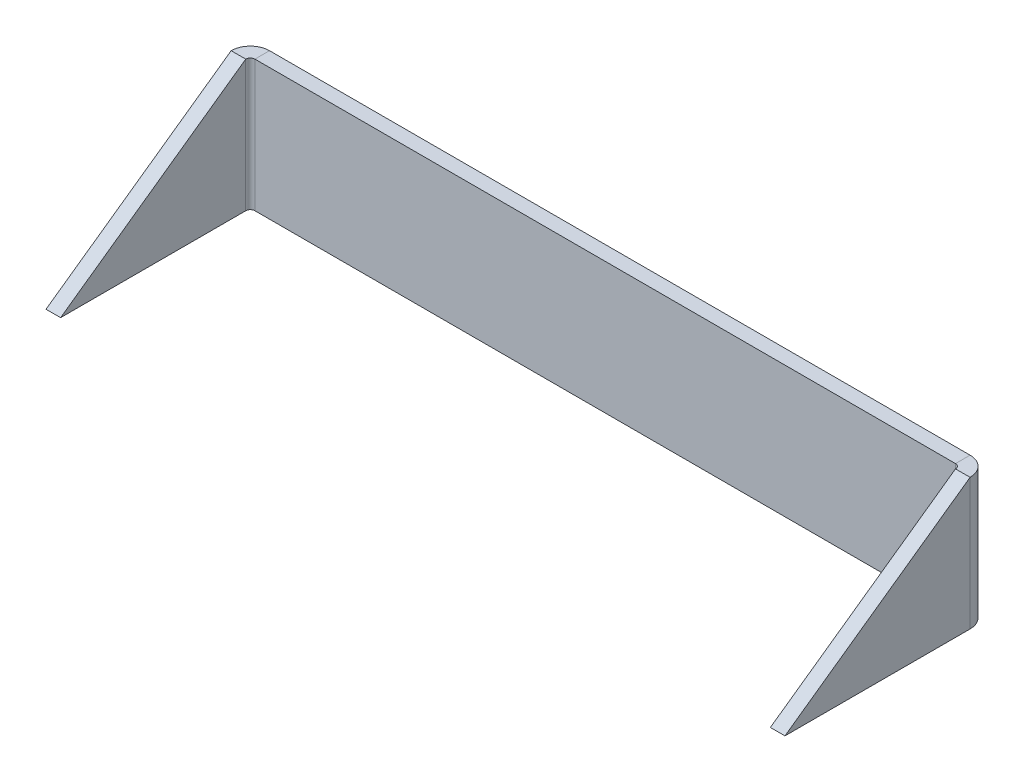
ISO-10303-21;
HEADER;
FILE_DESCRIPTION(('STEP AP214'),'2;1');
FILE_NAME('part.step','',(''),(''),'','','');
FILE_SCHEMA(('AUTOMOTIVE_DESIGN { 1 0 10303 214 1 1 1 1 }'));
ENDSEC;
DATA;
#1=APPLICATION_CONTEXT('core data for automotive mechanical design processes');
#2=APPLICATION_PROTOCOL_DEFINITION('international standard','automotive_design',2000,#1);
#3=PRODUCT_CONTEXT('',#1,'mechanical');
#4=PRODUCT('Part','Part','',(#3));
#5=PRODUCT_RELATED_PRODUCT_CATEGORY('part','',(#4));
#6=PRODUCT_DEFINITION_FORMATION('','',#4);
#7=PRODUCT_DEFINITION_CONTEXT('part definition',#1,'design');
#8=PRODUCT_DEFINITION('design','',#6,#7);
#9=PRODUCT_DEFINITION_SHAPE('','',#8);
#10=(LENGTH_UNIT() NAMED_UNIT(*) SI_UNIT(.MILLI.,.METRE.));
#11=(NAMED_UNIT(*) PLANE_ANGLE_UNIT() SI_UNIT($,.RADIAN.));
#12=(NAMED_UNIT(*) SI_UNIT($,.STERADIAN.) SOLID_ANGLE_UNIT());
#13=UNCERTAINTY_MEASURE_WITH_UNIT(LENGTH_MEASURE(1.E-05),#10,'distance_accuracy_value','');
#14=(GEOMETRIC_REPRESENTATION_CONTEXT(3) GLOBAL_UNCERTAINTY_ASSIGNED_CONTEXT((#13)) GLOBAL_UNIT_ASSIGNED_CONTEXT((#10,
#11,#12)) REPRESENTATION_CONTEXT('',''));
#15=CARTESIAN_POINT('',(0.,0.,0.));
#16=DIRECTION('',(0.,0.,1.));
#17=DIRECTION('',(1.,0.,0.));
#18=AXIS2_PLACEMENT_3D('',#15,#16,#17);
#19=CARTESIAN_POINT('',(-80.375,0.,-2.67290766625863E-13));
#20=DIRECTION('',(1.,0.,0.));
#21=DIRECTION('',(0.,0.,1.));
#22=AXIS2_PLACEMENT_3D('',#19,#20,#21);
#23=PLANE('',#22);
#24=DIRECTION('',(0.,-0.578649254314193,0.81557650804914));
#25=VECTOR('',#24,1.);
#26=CARTESIAN_POINT('',(-80.375,11.4738646979449,8.14067495329023));
#27=LINE('',#26,#25);
#28=CARTESIAN_POINT('',(-80.3750000000001,14.2875,4.17499999999999));
#29=VERTEX_POINT('',#28);
#30=CARTESIAN_POINT('',(-80.3750000000001,-14.2875,44.45));
#31=VERTEX_POINT('',#30);
#32=EDGE_CURVE('E248',#29,#31,#27,.T.);
#33=ORIENTED_EDGE('',*,*,#32,.F.);
#34=DIRECTION('',(0.,-1.,0.));
#35=VECTOR('',#34,1.);
#36=CARTESIAN_POINT('',(-80.375,14.2875,4.17499999999999));
#37=LINE('',#36,#35);
#38=CARTESIAN_POINT('',(-80.375,-14.2875,4.17499999999999));
#39=VERTEX_POINT('',#38);
#40=EDGE_CURVE('E240',#39,#29,#37,.F.);
#41=ORIENTED_EDGE('',*,*,#40,.F.);
#42=DIRECTION('',(0.,0.,1.));
#43=VECTOR('',#42,1.);
#44=CARTESIAN_POINT('',(-80.375,-14.2875,3.17499999999999));
#45=LINE('',#44,#43);
#46=EDGE_CURVE('E246',#31,#39,#45,.F.);
#47=ORIENTED_EDGE('',*,*,#46,.F.);
#48=EDGE_LOOP('',(#33,#41,#47));
#49=FACE_BOUND('',#48,.T.);
#50=ADVANCED_FACE('F77',(#49),#23,.F.);
#51=CARTESIAN_POINT('',(-77.2,0.,-2.56205313375036E-13));
#52=DIRECTION('',(1.,0.,0.));
#53=DIRECTION('',(0.,0.,1.));
#54=AXIS2_PLACEMENT_3D('',#51,#52,#53);
#55=PLANE('',#54);
#56=DIRECTION('',(0.,-1.,0.));
#57=VECTOR('',#56,1.);
#58=CARTESIAN_POINT('',(-77.2,14.2875,4.175));
#59=LINE('',#58,#57);
#60=CARTESIAN_POINT('',(-77.2,14.2875,4.175));
#61=VERTEX_POINT('',#60);
#62=CARTESIAN_POINT('',(-77.2,-14.2875,4.175));
#63=VERTEX_POINT('',#62);
#64=EDGE_CURVE('E241',#61,#63,#59,.T.);
#65=ORIENTED_EDGE('',*,*,#64,.F.);
#66=DIRECTION('',(0.,-0.578649254314193,0.815576508049139));
#67=VECTOR('',#66,1.);
#68=CARTESIAN_POINT('',(-77.2,11.4738646979449,8.14067495329025));
#69=LINE('',#68,#67);
#70=CARTESIAN_POINT('',(-77.2000000000001,-14.2875,44.45));
#71=VERTEX_POINT('',#70);
#72=EDGE_CURVE('E504',#61,#71,#69,.T.);
#73=ORIENTED_EDGE('',*,*,#72,.T.);
#74=DIRECTION('',(0.,0.,-1.));
#75=VECTOR('',#74,1.);
#76=CARTESIAN_POINT('',(-77.2,-14.2875,-2.57406275781481E-13));
#77=LINE('',#76,#75);
#78=EDGE_CURVE('E249',#71,#63,#77,.T.);
#79=ORIENTED_EDGE('',*,*,#78,.T.);
#80=EDGE_LOOP('',(#65,#73,#79));
#81=FACE_BOUND('',#80,.T.);
#82=ADVANCED_FACE('F312',(#81),#55,.T.);
#83=CARTESIAN_POINT('',(-76.2,14.2875,3.175));
#84=DIRECTION('',(0.,-1.,0.));
#85=DIRECTION('',(0.,0.,-1.));
#86=AXIS2_PLACEMENT_3D('',#83,#84,#85);
#87=PLANE('',#86);
#88=DIRECTION('',(-1.,0.,0.));
#89=VECTOR('',#88,1.);
#90=CARTESIAN_POINT('',(-76.2,14.2875,0.));
#91=LINE('',#90,#89);
#92=CARTESIAN_POINT('',(76.2,14.2875,0.));
#93=VERTEX_POINT('',#92);
#94=CARTESIAN_POINT('',(-76.2,14.2875,0.));
#95=VERTEX_POINT('',#94);
#96=EDGE_CURVE('E105',#93,#95,#91,.T.);
#97=ORIENTED_EDGE('',*,*,#96,.T.);
#98=DIRECTION('',(0.,0.,-1.));
#99=VECTOR('',#98,1.);
#100=CARTESIAN_POINT('',(-76.2,14.2875,3.175));
#101=LINE('',#100,#99);
#102=CARTESIAN_POINT('',(-76.2,14.2875,3.175));
#103=VERTEX_POINT('',#102);
#104=EDGE_CURVE('E86',#103,#95,#101,.T.);
#105=ORIENTED_EDGE('',*,*,#104,.F.);
#106=DIRECTION('',(-1.,0.,0.));
#107=VECTOR('',#106,1.);
#108=CARTESIAN_POINT('',(-76.2,14.2875,3.175));
#109=LINE('',#108,#107);
#110=CARTESIAN_POINT('',(76.2,14.2875,3.175));
#111=VERTEX_POINT('',#110);
#112=EDGE_CURVE('E122',#111,#103,#109,.T.);
#113=ORIENTED_EDGE('',*,*,#112,.F.);
#114=DIRECTION('',(0.,0.,-1.));
#115=VECTOR('',#114,1.);
#116=CARTESIAN_POINT('',(76.2,14.2875,3.175));
#117=LINE('',#116,#115);
#118=EDGE_CURVE('E13',#111,#93,#117,.T.);
#119=ORIENTED_EDGE('',*,*,#118,.T.);
#120=EDGE_LOOP('',(#97,#105,#113,#119));
#121=FACE_BOUND('',#120,.T.);
#122=ADVANCED_FACE('F79',(#121),#87,.F.);
#123=CARTESIAN_POINT('',(-76.2,-14.2875,3.175));
#124=DIRECTION('',(0.,1.,0.));
#125=DIRECTION('',(0.,0.,1.));
#126=AXIS2_PLACEMENT_3D('',#123,#124,#125);
#127=PLANE('',#126);
#128=DIRECTION('',(1.,0.,0.));
#129=VECTOR('',#128,1.);
#130=CARTESIAN_POINT('',(-76.2,-14.2875,0.));
#131=LINE('',#130,#129);
#132=CARTESIAN_POINT('',(-76.2,-14.2875,0.));
#133=VERTEX_POINT('',#132);
#134=CARTESIAN_POINT('',(76.2,-14.2875,0.));
#135=VERTEX_POINT('',#134);
#136=EDGE_CURVE('E198',#133,#135,#131,.T.);
#137=ORIENTED_EDGE('',*,*,#136,.T.);
#138=DIRECTION('',(0.,0.,-1.));
#139=VECTOR('',#138,1.);
#140=CARTESIAN_POINT('',(76.2,-14.2875,3.175));
#141=LINE('',#140,#139);
#142=CARTESIAN_POINT('',(76.2,-14.2875,3.175));
#143=VERTEX_POINT('',#142);
#144=EDGE_CURVE('E201',#143,#135,#141,.T.);
#145=ORIENTED_EDGE('',*,*,#144,.F.);
#146=DIRECTION('',(1.,0.,0.));
#147=VECTOR('',#146,1.);
#148=CARTESIAN_POINT('',(-76.2,-14.2875,3.175));
#149=LINE('',#148,#147);
#150=CARTESIAN_POINT('',(-76.2,-14.2875,3.175));
#151=VERTEX_POINT('',#150);
#152=EDGE_CURVE('E94',#151,#143,#149,.T.);
#153=ORIENTED_EDGE('',*,*,#152,.F.);
#154=DIRECTION('',(0.,0.,-1.));
#155=VECTOR('',#154,1.);
#156=CARTESIAN_POINT('',(-76.2,-14.2875,3.175));
#157=LINE('',#156,#155);
#158=EDGE_CURVE('E134',#151,#133,#157,.T.);
#159=ORIENTED_EDGE('',*,*,#158,.T.);
#160=EDGE_LOOP('',(#137,#145,#153,#159));
#161=FACE_BOUND('',#160,.T.);
#162=ADVANCED_FACE('F215',(#161),#127,.F.);
#163=CARTESIAN_POINT('',(0.,0.,3.175));
#164=DIRECTION('',(0.,0.,1.));
#165=DIRECTION('',(1.,0.,0.));
#166=AXIS2_PLACEMENT_3D('',#163,#164,#165);
#167=PLANE('',#166);
#168=DIRECTION('',(0.,1.,0.));
#169=VECTOR('',#168,1.);
#170=CARTESIAN_POINT('',(76.2,14.2875,3.175));
#171=LINE('',#170,#169);
#172=EDGE_CURVE('E127',#143,#111,#171,.T.);
#173=ORIENTED_EDGE('',*,*,#172,.T.);
#174=ORIENTED_EDGE('',*,*,#112,.T.);
#175=DIRECTION('',(0.,-1.,0.));
#176=VECTOR('',#175,1.);
#177=CARTESIAN_POINT('',(-76.2,14.2875,3.175));
#178=LINE('',#177,#176);
#179=EDGE_CURVE('E125',#103,#151,#178,.T.);
#180=ORIENTED_EDGE('',*,*,#179,.T.);
#181=ORIENTED_EDGE('',*,*,#152,.T.);
#182=EDGE_LOOP('',(#173,#174,#180,#181));
#183=FACE_BOUND('',#182,.T.);
#184=ADVANCED_FACE('F123',(#183),#167,.T.);
#185=CARTESIAN_POINT('',(0.,0.,0.));
#186=DIRECTION('',(0.,0.,1.));
#187=DIRECTION('',(1.,0.,0.));
#188=AXIS2_PLACEMENT_3D('',#185,#186,#187);
#189=PLANE('',#188);
#190=DIRECTION('',(0.,1.,0.));
#191=VECTOR('',#190,1.);
#192=CARTESIAN_POINT('',(76.2,14.2875,0.));
#193=LINE('',#192,#191);
#194=EDGE_CURVE('E189',#135,#93,#193,.T.);
#195=ORIENTED_EDGE('',*,*,#194,.F.);
#196=ORIENTED_EDGE('',*,*,#136,.F.);
#197=DIRECTION('',(0.,-1.,0.));
#198=VECTOR('',#197,1.);
#199=CARTESIAN_POINT('',(-76.2,14.2875,0.));
#200=LINE('',#199,#198);
#201=EDGE_CURVE('E205',#95,#133,#200,.T.);
#202=ORIENTED_EDGE('',*,*,#201,.F.);
#203=ORIENTED_EDGE('',*,*,#96,.F.);
#204=EDGE_LOOP('',(#195,#196,#202,#203));
#205=FACE_BOUND('',#204,.T.);
#206=ADVANCED_FACE('F297',(#205),#189,.F.);
#207=CARTESIAN_POINT('',(76.2,-14.2875,4.175));
#208=DIRECTION('',(0.,-1.,0.));
#209=DIRECTION('',(0.,0.,-1.));
#210=AXIS2_PLACEMENT_3D('',#207,#208,#209);
#211=PLANE('',#210);
#212=DIRECTION('',(-1.,0.,0.));
#213=VECTOR('',#212,1.);
#214=CARTESIAN_POINT('',(80.375,-14.2875,4.17499999999999));
#215=LINE('',#214,#213);
#216=CARTESIAN_POINT('',(77.2,-14.2875,4.175));
#217=VERTEX_POINT('',#216);
#218=CARTESIAN_POINT('',(80.375,-14.2875,4.17499999999999));
#219=VERTEX_POINT('',#218);
#220=EDGE_CURVE('E165',#217,#219,#215,.F.);
#221=ORIENTED_EDGE('',*,*,#220,.F.);
#222=CARTESIAN_POINT('',(76.2,-14.2875,4.175));
#223=DIRECTION('',(0.,1.,0.));
#224=DIRECTION('',(0.,0.,1.));
#225=AXIS2_PLACEMENT_3D('',#222,#223,#224);
#226=CIRCLE('',#225,1.);
#227=EDGE_CURVE('E193',#143,#217,#226,.F.);
#228=ORIENTED_EDGE('',*,*,#227,.F.);
#229=ORIENTED_EDGE('',*,*,#144,.T.);
#230=CARTESIAN_POINT('',(76.2,-14.2875,4.175));
#231=DIRECTION('',(0.,1.,0.));
#232=DIRECTION('',(0.,0.,1.));
#233=AXIS2_PLACEMENT_3D('',#230,#231,#232);
#234=CIRCLE('',#233,4.175);
#235=EDGE_CURVE('E186',#135,#219,#234,.F.);
#236=ORIENTED_EDGE('',*,*,#235,.T.);
#237=EDGE_LOOP('',(#221,#228,#229,#236));
#238=FACE_BOUND('',#237,.T.);
#239=ADVANCED_FACE('F299',(#238),#211,.T.);
#240=CARTESIAN_POINT('',(76.2,14.2875,4.175));
#241=DIRECTION('',(0.,-1.,0.));
#242=DIRECTION('',(0.,0.,-1.));
#243=AXIS2_PLACEMENT_3D('',#240,#241,#242);
#244=PLANE('',#243);
#245=CARTESIAN_POINT('',(76.2,14.2875,4.175));
#246=DIRECTION('',(0.,1.,0.));
#247=DIRECTION('',(0.,0.,1.));
#248=AXIS2_PLACEMENT_3D('',#245,#246,#247);
#249=CIRCLE('',#248,1.);
#250=CARTESIAN_POINT('',(77.2,14.2875,4.175));
#251=VERTEX_POINT('',#250);
#252=EDGE_CURVE('E169',#251,#111,#249,.T.);
#253=ORIENTED_EDGE('',*,*,#252,.F.);
#254=DIRECTION('',(-1.,0.,0.));
#255=VECTOR('',#254,1.);
#256=CARTESIAN_POINT('',(77.2,14.2875,4.175));
#257=LINE('',#256,#255);
#258=CARTESIAN_POINT('',(80.3750000000001,14.2875,4.17499999999999));
#259=VERTEX_POINT('',#258);
#260=EDGE_CURVE('E178',#251,#259,#257,.F.);
#261=ORIENTED_EDGE('',*,*,#260,.T.);
#262=CARTESIAN_POINT('',(76.2,14.2875,4.175));
#263=DIRECTION('',(0.,1.,0.));
#264=DIRECTION('',(0.,0.,1.));
#265=AXIS2_PLACEMENT_3D('',#262,#263,#264);
#266=CIRCLE('',#265,4.175);
#267=EDGE_CURVE('E190',#259,#93,#266,.T.);
#268=ORIENTED_EDGE('',*,*,#267,.T.);
#269=ORIENTED_EDGE('',*,*,#118,.F.);
#270=EDGE_LOOP('',(#253,#261,#268,#269));
#271=FACE_BOUND('',#270,.T.);
#272=ADVANCED_FACE('F291',(#271),#244,.F.);
#273=CARTESIAN_POINT('',(76.2,14.2875,4.175));
#274=DIRECTION('',(0.,1.,0.));
#275=DIRECTION('',(1.,0.,0.));
#276=AXIS2_PLACEMENT_3D('',#273,#274,#275);
#277=CYLINDRICAL_SURFACE('',#276,4.175);
#278=ORIENTED_EDGE('',*,*,#194,.T.);
#279=ORIENTED_EDGE('',*,*,#267,.F.);
#280=DIRECTION('',(0.,1.,0.));
#281=VECTOR('',#280,1.);
#282=CARTESIAN_POINT('',(80.375,-14.2875,4.17499999999999));
#283=LINE('',#282,#281);
#284=EDGE_CURVE('E176',#259,#219,#283,.F.);
#285=ORIENTED_EDGE('',*,*,#284,.T.);
#286=ORIENTED_EDGE('',*,*,#235,.F.);
#287=EDGE_LOOP('',(#278,#279,#285,#286));
#288=FACE_BOUND('',#287,.T.);
#289=ADVANCED_FACE('F295',(#288),#277,.T.);
#290=CARTESIAN_POINT('',(76.2,14.2875,4.175));
#291=DIRECTION('',(0.,1.,0.));
#292=DIRECTION('',(1.,0.,0.));
#293=AXIS2_PLACEMENT_3D('',#290,#291,#292);
#294=CYLINDRICAL_SURFACE('',#293,1.);
#295=ORIENTED_EDGE('',*,*,#172,.F.);
#296=ORIENTED_EDGE('',*,*,#227,.T.);
#297=DIRECTION('',(0.,1.,0.));
#298=VECTOR('',#297,1.);
#299=CARTESIAN_POINT('',(77.2,-14.2875,4.175));
#300=LINE('',#299,#298);
#301=EDGE_CURVE('E181',#217,#251,#300,.T.);
#302=ORIENTED_EDGE('',*,*,#301,.T.);
#303=ORIENTED_EDGE('',*,*,#252,.T.);
#304=EDGE_LOOP('',(#295,#296,#302,#303));
#305=FACE_BOUND('',#304,.T.);
#306=ADVANCED_FACE('F288',(#305),#294,.F.);
#307=CARTESIAN_POINT('',(80.375,-14.2875,3.17499999999999));
#308=DIRECTION('',(0.,1.,0.));
#309=DIRECTION('',(0.,0.,1.));
#310=AXIS2_PLACEMENT_3D('',#307,#308,#309);
#311=PLANE('',#310);
#312=ORIENTED_EDGE('',*,*,#220,.T.);
#313=DIRECTION('',(0.,0.,-1.));
#314=VECTOR('',#313,1.);
#315=CARTESIAN_POINT('',(80.375,-14.2875,-2.68491729032308E-13));
#316=LINE('',#315,#314);
#317=CARTESIAN_POINT('',(80.3750000000001,-14.2875,44.45));
#318=VERTEX_POINT('',#317);
#319=EDGE_CURVE('E170',#318,#219,#316,.T.);
#320=ORIENTED_EDGE('',*,*,#319,.F.);
#321=DIRECTION('',(-1.,0.,0.));
#322=VECTOR('',#321,1.);
#323=CARTESIAN_POINT('',(80.3750000000001,-14.2875,44.45));
#324=LINE('',#323,#322);
#325=CARTESIAN_POINT('',(77.2000000000001,-14.2875,44.45));
#326=VERTEX_POINT('',#325);
#327=EDGE_CURVE('E166',#318,#326,#324,.T.);
#328=ORIENTED_EDGE('',*,*,#327,.T.);
#329=DIRECTION('',(0.,0.,1.));
#330=VECTOR('',#329,1.);
#331=CARTESIAN_POINT('',(77.2,-14.2875,3.175));
#332=LINE('',#331,#330);
#333=EDGE_CURVE('E173',#326,#217,#332,.F.);
#334=ORIENTED_EDGE('',*,*,#333,.T.);
#335=EDGE_LOOP('',(#312,#320,#328,#334));
#336=FACE_BOUND('',#335,.T.);
#337=ADVANCED_FACE('F284',(#336),#311,.F.);
#338=CARTESIAN_POINT('',(80.375,0.,-2.67290766625863E-13));
#339=DIRECTION('',(-1.,0.,0.));
#340=DIRECTION('',(0.,0.,1.));
#341=AXIS2_PLACEMENT_3D('',#338,#339,#340);
#342=PLANE('',#341);
#343=ORIENTED_EDGE('',*,*,#284,.F.);
#344=DIRECTION('',(0.,-0.578649254314193,0.81557650804914));
#345=VECTOR('',#344,1.);
#346=CARTESIAN_POINT('',(80.375,11.4738646979449,8.14067495329023));
#347=LINE('',#346,#345);
#348=EDGE_CURVE('E162',#259,#318,#347,.T.);
#349=ORIENTED_EDGE('',*,*,#348,.T.);
#350=ORIENTED_EDGE('',*,*,#319,.T.);
#351=EDGE_LOOP('',(#343,#349,#350));
#352=FACE_BOUND('',#351,.T.);
#353=ADVANCED_FACE('F301',(#352),#342,.F.);
#354=CARTESIAN_POINT('',(77.2,0.,-2.56205313375036E-13));
#355=DIRECTION('',(-1.,0.,0.));
#356=DIRECTION('',(0.,0.,1.));
#357=AXIS2_PLACEMENT_3D('',#354,#355,#356);
#358=PLANE('',#357);
#359=DIRECTION('',(0.,-0.578649254314193,0.815576508049139));
#360=VECTOR('',#359,1.);
#361=CARTESIAN_POINT('',(77.2,11.4738646979449,8.14067495329025));
#362=LINE('',#361,#360);
#363=EDGE_CURVE('E159',#251,#326,#362,.T.);
#364=ORIENTED_EDGE('',*,*,#363,.F.);
#365=ORIENTED_EDGE('',*,*,#301,.F.);
#366=ORIENTED_EDGE('',*,*,#333,.F.);
#367=EDGE_LOOP('',(#364,#365,#366));
#368=FACE_BOUND('',#367,.T.);
#369=ADVANCED_FACE('F285',(#368),#358,.T.);
#370=CARTESIAN_POINT('',(80.375012,11.4738646979449,8.14067495329023));
#371=DIRECTION('',(0.,-0.81557650804914,-0.578649254314193));
#372=DIRECTION('',(0.,0.578649254314193,-0.81557650804914));
#373=AXIS2_PLACEMENT_3D('',#370,#371,#372);
#374=PLANE('',#373);
#375=ORIENTED_EDGE('',*,*,#260,.F.);
#376=ORIENTED_EDGE('',*,*,#363,.T.);
#377=ORIENTED_EDGE('',*,*,#327,.F.);
#378=ORIENTED_EDGE('',*,*,#348,.F.);
#379=EDGE_LOOP('',(#375,#376,#377,#378));
#380=FACE_BOUND('',#379,.T.);
#381=ADVANCED_FACE('F278',(#380),#374,.F.);
#382=CARTESIAN_POINT('',(-76.2,14.2875,4.175));
#383=DIRECTION('',(0.,1.,0.));
#384=DIRECTION('',(0.,0.,1.));
#385=AXIS2_PLACEMENT_3D('',#382,#383,#384);
#386=PLANE('',#385);
#387=DIRECTION('',(-1.,0.,0.));
#388=VECTOR('',#387,1.);
#389=CARTESIAN_POINT('',(-80.375,14.2875,4.17499999999999));
#390=LINE('',#389,#388);
#391=EDGE_CURVE('E149',#61,#29,#390,.T.);
#392=ORIENTED_EDGE('',*,*,#391,.F.);
#393=CARTESIAN_POINT('',(-76.2,14.2875,4.175));
#394=DIRECTION('',(0.,-1.,0.));
#395=DIRECTION('',(0.,0.,-1.));
#396=AXIS2_PLACEMENT_3D('',#393,#394,#395);
#397=CIRCLE('',#396,1.);
#398=EDGE_CURVE('E141',#103,#61,#397,.F.);
#399=ORIENTED_EDGE('',*,*,#398,.F.);
#400=ORIENTED_EDGE('',*,*,#104,.T.);
#401=CARTESIAN_POINT('',(-76.2,14.2875,4.175));
#402=DIRECTION('',(0.,-1.,0.));
#403=DIRECTION('',(0.,0.,-1.));
#404=AXIS2_PLACEMENT_3D('',#401,#402,#403);
#405=CIRCLE('',#404,4.175);
#406=EDGE_CURVE('E153',#95,#29,#405,.F.);
#407=ORIENTED_EDGE('',*,*,#406,.T.);
#408=EDGE_LOOP('',(#392,#399,#400,#407));
#409=FACE_BOUND('',#408,.T.);
#410=ADVANCED_FACE('F147',(#409),#386,.T.);
#411=CARTESIAN_POINT('',(-76.2,-14.2875,4.175));
#412=DIRECTION('',(0.,1.,0.));
#413=DIRECTION('',(0.,0.,1.));
#414=AXIS2_PLACEMENT_3D('',#411,#412,#413);
#415=PLANE('',#414);
#416=CARTESIAN_POINT('',(-76.2,-14.2875,4.175));
#417=DIRECTION('',(0.,-1.,0.));
#418=DIRECTION('',(0.,0.,-1.));
#419=AXIS2_PLACEMENT_3D('',#416,#417,#418);
#420=CIRCLE('',#419,1.);
#421=EDGE_CURVE('E144',#63,#151,#420,.T.);
#422=ORIENTED_EDGE('',*,*,#421,.F.);
#423=DIRECTION('',(-1.,0.,0.));
#424=VECTOR('',#423,1.);
#425=CARTESIAN_POINT('',(-77.2,-14.2875,4.175));
#426=LINE('',#425,#424);
#427=EDGE_CURVE('E231',#63,#39,#426,.T.);
#428=ORIENTED_EDGE('',*,*,#427,.T.);
#429=CARTESIAN_POINT('',(-76.2,-14.2875,4.175));
#430=DIRECTION('',(0.,-1.,0.));
#431=DIRECTION('',(0.,0.,-1.));
#432=AXIS2_PLACEMENT_3D('',#429,#430,#431);
#433=CIRCLE('',#432,4.175);
#434=EDGE_CURVE('E150',#39,#133,#433,.T.);
#435=ORIENTED_EDGE('',*,*,#434,.T.);
#436=ORIENTED_EDGE('',*,*,#158,.F.);
#437=EDGE_LOOP('',(#422,#428,#435,#436));
#438=FACE_BOUND('',#437,.T.);
#439=ADVANCED_FACE('F229',(#438),#415,.F.);
#440=CARTESIAN_POINT('',(-76.2,-14.2875,4.175));
#441=DIRECTION('',(0.,-1.,0.));
#442=DIRECTION('',(-1.,0.,0.));
#443=AXIS2_PLACEMENT_3D('',#440,#441,#442);
#444=CYLINDRICAL_SURFACE('',#443,4.175);
#445=ORIENTED_EDGE('',*,*,#201,.T.);
#446=ORIENTED_EDGE('',*,*,#434,.F.);
#447=ORIENTED_EDGE('',*,*,#40,.T.);
#448=ORIENTED_EDGE('',*,*,#406,.F.);
#449=EDGE_LOOP('',(#445,#446,#447,#448));
#450=FACE_BOUND('',#449,.T.);
#451=ADVANCED_FACE('F224',(#450),#444,.T.);
#452=CARTESIAN_POINT('',(-76.2,-14.2875,4.175));
#453=DIRECTION('',(0.,-1.,0.));
#454=DIRECTION('',(-1.,0.,0.));
#455=AXIS2_PLACEMENT_3D('',#452,#453,#454);
#456=CYLINDRICAL_SURFACE('',#455,1.);
#457=ORIENTED_EDGE('',*,*,#179,.F.);
#458=ORIENTED_EDGE('',*,*,#398,.T.);
#459=ORIENTED_EDGE('',*,*,#64,.T.);
#460=ORIENTED_EDGE('',*,*,#421,.T.);
#461=EDGE_LOOP('',(#457,#458,#459,#460));
#462=FACE_BOUND('',#461,.T.);
#463=ADVANCED_FACE('F138',(#462),#456,.F.);
#464=CARTESIAN_POINT('',(-80.375,-14.2875,3.17499999999999));
#465=DIRECTION('',(0.,-1.,0.));
#466=DIRECTION('',(0.,0.,-1.));
#467=AXIS2_PLACEMENT_3D('',#464,#465,#466);
#468=PLANE('',#467);
#469=ORIENTED_EDGE('',*,*,#46,.T.);
#470=ORIENTED_EDGE('',*,*,#427,.F.);
#471=ORIENTED_EDGE('',*,*,#78,.F.);
#472=DIRECTION('',(1.,0.,0.));
#473=VECTOR('',#472,1.);
#474=CARTESIAN_POINT('',(-80.3750000000001,-14.2875,44.45));
#475=LINE('',#474,#473);
#476=EDGE_CURVE('E155',#31,#71,#475,.T.);
#477=ORIENTED_EDGE('',*,*,#476,.F.);
#478=EDGE_LOOP('',(#469,#470,#471,#477));
#479=FACE_BOUND('',#478,.T.);
#480=ADVANCED_FACE('F252',(#479),#468,.T.);
#481=CARTESIAN_POINT('',(-80.375012,11.4738646979449,8.14067495329023));
#482=DIRECTION('',(0.,0.81557650804914,0.578649254314193));
#483=DIRECTION('',(0.,-0.578649254314193,0.81557650804914));
#484=AXIS2_PLACEMENT_3D('',#481,#482,#483);
#485=PLANE('',#484);
#486=ORIENTED_EDGE('',*,*,#32,.T.);
#487=ORIENTED_EDGE('',*,*,#476,.T.);
#488=ORIENTED_EDGE('',*,*,#72,.F.);
#489=ORIENTED_EDGE('',*,*,#391,.T.);
#490=EDGE_LOOP('',(#486,#487,#488,#489));
#491=FACE_BOUND('',#490,.T.);
#492=ADVANCED_FACE('F320',(#491),#485,.T.);
#493=CLOSED_SHELL('',(#50,#82,#122,#162,#184,#206,#239,#272,#289,#306,#337,#353,#369,#381,#410,
#439,#451,#463,#480,#492));
#494=MANIFOLD_SOLID_BREP('B2',#493);
#495=ADVANCED_BREP_SHAPE_REPRESENTATION('',(#18,#494),#14);
#496=SHAPE_DEFINITION_REPRESENTATION(#9,#495);
ENDSEC;
END-ISO-10303-21;
